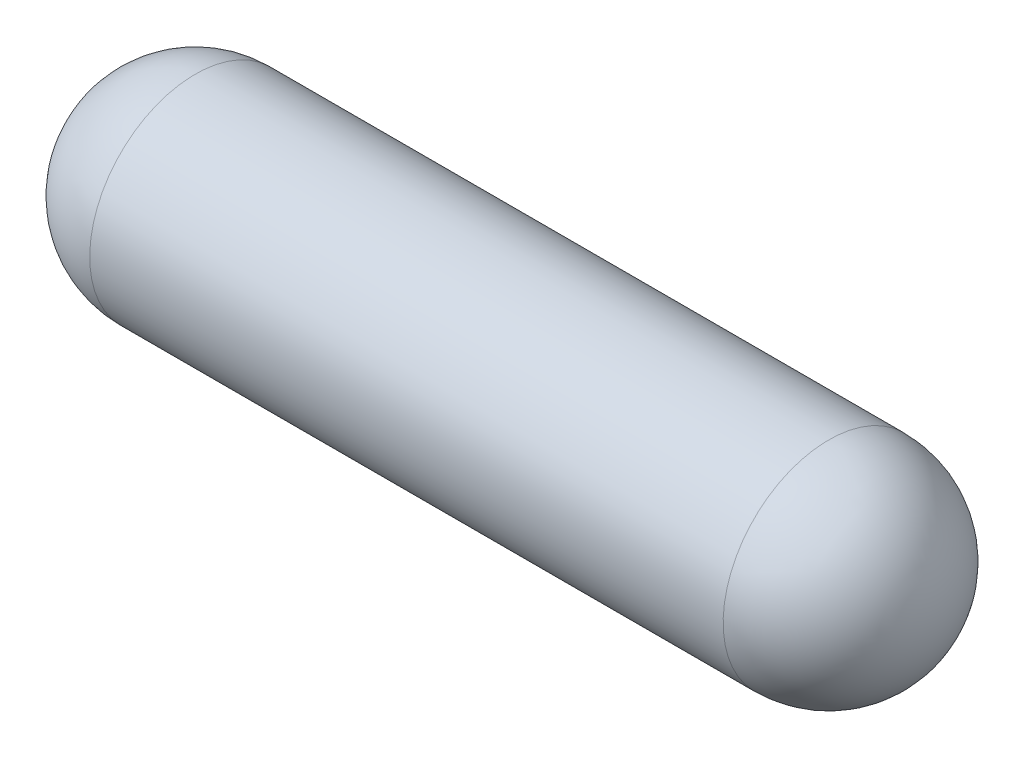
ISO-10303-21;
HEADER;
FILE_DESCRIPTION(('STEP AP214'),'2;1');
FILE_NAME('part.step','',(''),(''),'','','');
FILE_SCHEMA(('AUTOMOTIVE_DESIGN { 1 0 10303 214 1 1 1 1 }'));
ENDSEC;
DATA;
#1=APPLICATION_CONTEXT('core data for automotive mechanical design processes');
#2=APPLICATION_PROTOCOL_DEFINITION('international standard','automotive_design',2000,#1);
#3=PRODUCT_CONTEXT('',#1,'mechanical');
#4=PRODUCT('Part','Part','',(#3));
#5=PRODUCT_RELATED_PRODUCT_CATEGORY('part','',(#4));
#6=PRODUCT_DEFINITION_FORMATION('','',#4);
#7=PRODUCT_DEFINITION_CONTEXT('part definition',#1,'design');
#8=PRODUCT_DEFINITION('design','',#6,#7);
#9=PRODUCT_DEFINITION_SHAPE('','',#8);
#10=(LENGTH_UNIT() NAMED_UNIT(*) SI_UNIT(.MILLI.,.METRE.));
#11=(NAMED_UNIT(*) PLANE_ANGLE_UNIT() SI_UNIT($,.RADIAN.));
#12=(NAMED_UNIT(*) SI_UNIT($,.STERADIAN.) SOLID_ANGLE_UNIT());
#13=UNCERTAINTY_MEASURE_WITH_UNIT(LENGTH_MEASURE(1.E-05),#10,'distance_accuracy_value','');
#14=(GEOMETRIC_REPRESENTATION_CONTEXT(3) GLOBAL_UNCERTAINTY_ASSIGNED_CONTEXT((#13)) GLOBAL_UNIT_ASSIGNED_CONTEXT((#10,
#11,#12)) REPRESENTATION_CONTEXT('',''));
#15=CARTESIAN_POINT('',(0.,0.,0.));
#16=DIRECTION('',(0.,0.,1.));
#17=DIRECTION('',(1.,0.,0.));
#18=AXIS2_PLACEMENT_3D('',#15,#16,#17);
#19=CARTESIAN_POINT('',(0.,6.35,0.));
#20=DIRECTION('',(1.,0.,0.));
#21=DIRECTION('',(0.,-1.,0.));
#22=AXIS2_PLACEMENT_3D('',#19,#20,#21);
#23=SPHERICAL_SURFACE('',#22,6.35);
#24=CARTESIAN_POINT('',(0.,6.35,0.));
#25=DIRECTION('',(1.,0.,0.));
#26=DIRECTION('',(0.,0.,-1.));
#27=AXIS2_PLACEMENT_3D('',#24,#25,#26);
#28=CIRCLE('',#27,6.35);
#29=CARTESIAN_POINT('',(0.,6.35,-6.35));
#30=VERTEX_POINT('',#29);
#31=EDGE_CURVE('E10',#30,#30,#28,.T.);
#32=ORIENTED_EDGE('',*,*,#31,.F.);
#33=EDGE_LOOP('',(#32));
#34=FACE_BOUND('',#33,.T.);
#35=ADVANCED_FACE('F43',(#34),#23,.T.);
#36=CARTESIAN_POINT('',(44.45,6.35,0.));
#37=DIRECTION('',(1.,0.,0.));
#38=DIRECTION('',(0.,0.,-1.));
#39=AXIS2_PLACEMENT_3D('',#36,#37,#38);
#40=CYLINDRICAL_SURFACE('',#39,6.35);
#41=CARTESIAN_POINT('',(38.1,6.35,0.));
#42=DIRECTION('',(1.,0.,0.));
#43=DIRECTION('',(0.,0.,-1.));
#44=AXIS2_PLACEMENT_3D('',#41,#42,#43);
#45=CIRCLE('',#44,6.35);
#46=CARTESIAN_POINT('',(38.1,6.35,-6.35));
#47=VERTEX_POINT('',#46);
#48=EDGE_CURVE('E50',#47,#47,#45,.T.);
#49=ORIENTED_EDGE('',*,*,#48,.F.);
#50=EDGE_LOOP('',(#49));
#51=FACE_BOUND('',#50,.T.);
#52=ORIENTED_EDGE('',*,*,#31,.T.);
#53=EDGE_LOOP('',(#52));
#54=FACE_BOUND('',#53,.T.);
#55=ADVANCED_FACE('F59',(#51,#54),#40,.T.);
#56=CARTESIAN_POINT('',(38.1,6.35,0.));
#57=DIRECTION('',(1.,0.,0.));
#58=DIRECTION('',(0.,-1.,0.));
#59=AXIS2_PLACEMENT_3D('',#56,#57,#58);
#60=SPHERICAL_SURFACE('',#59,6.35);
#61=ORIENTED_EDGE('',*,*,#48,.T.);
#62=EDGE_LOOP('',(#61));
#63=FACE_BOUND('',#62,.T.);
#64=ADVANCED_FACE('F57',(#63),#60,.T.);
#65=CLOSED_SHELL('',(#35,#55,#64));
#66=MANIFOLD_SOLID_BREP('B2',#65);
#67=ADVANCED_BREP_SHAPE_REPRESENTATION('',(#18,#66),#14);
#68=SHAPE_DEFINITION_REPRESENTATION(#9,#67);
ENDSEC;
END-ISO-10303-21;
